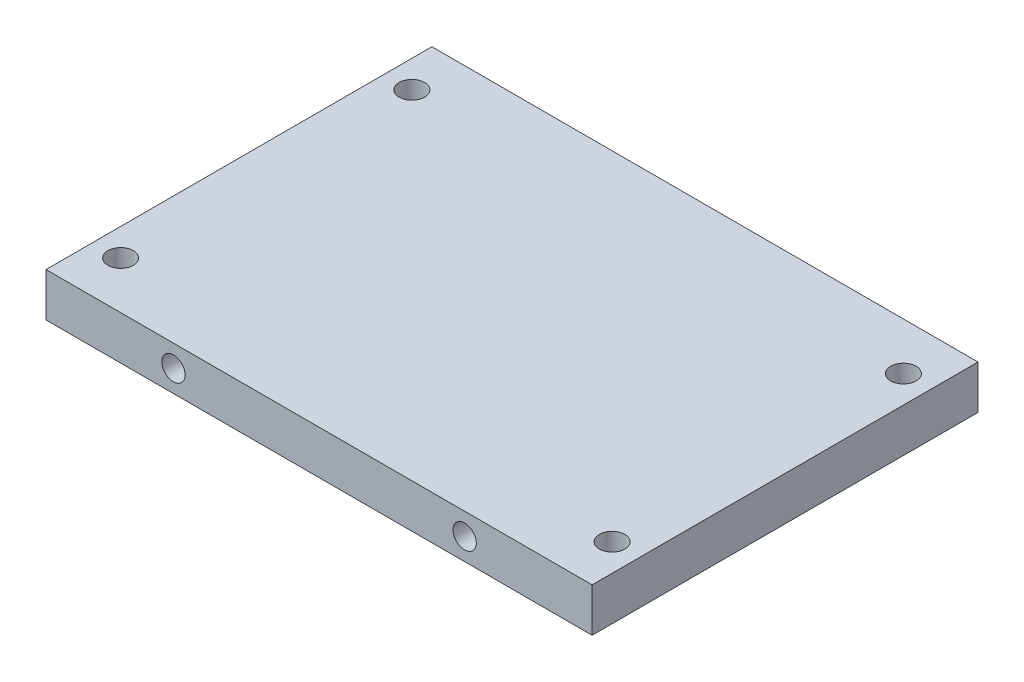
ISO-10303-21;
HEADER;
FILE_DESCRIPTION(('STEP AP214'),'2;1');
FILE_NAME('part.step','',(''),(''),'','','');
FILE_SCHEMA(('AUTOMOTIVE_DESIGN { 1 0 10303 214 1 1 1 1 }'));
ENDSEC;
DATA;
#1=APPLICATION_CONTEXT('core data for automotive mechanical design processes');
#2=APPLICATION_PROTOCOL_DEFINITION('international standard','automotive_design',2000,#1);
#3=PRODUCT_CONTEXT('',#1,'mechanical');
#4=PRODUCT('Part','Part','',(#3));
#5=PRODUCT_RELATED_PRODUCT_CATEGORY('part','',(#4));
#6=PRODUCT_DEFINITION_FORMATION('','',#4);
#7=PRODUCT_DEFINITION_CONTEXT('part definition',#1,'design');
#8=PRODUCT_DEFINITION('design','',#6,#7);
#9=PRODUCT_DEFINITION_SHAPE('','',#8);
#10=(LENGTH_UNIT() NAMED_UNIT(*) SI_UNIT(.MILLI.,.METRE.));
#11=(NAMED_UNIT(*) PLANE_ANGLE_UNIT() SI_UNIT($,.RADIAN.));
#12=(NAMED_UNIT(*) SI_UNIT($,.STERADIAN.) SOLID_ANGLE_UNIT());
#13=UNCERTAINTY_MEASURE_WITH_UNIT(LENGTH_MEASURE(1.E-05),#10,'distance_accuracy_value','');
#14=(GEOMETRIC_REPRESENTATION_CONTEXT(3) GLOBAL_UNCERTAINTY_ASSIGNED_CONTEXT((#13)) GLOBAL_UNIT_ASSIGNED_CONTEXT((#10,
#11,#12)) REPRESENTATION_CONTEXT('',''));
#15=CARTESIAN_POINT('',(0.,0.,0.));
#16=DIRECTION('',(0.,0.,1.));
#17=DIRECTION('',(1.,0.,0.));
#18=AXIS2_PLACEMENT_3D('',#15,#16,#17);
#19=CARTESIAN_POINT('',(0.,6.,53.));
#20=DIRECTION('',(0.,0.,-1.));
#21=DIRECTION('',(-1.,0.,0.));
#22=AXIS2_PLACEMENT_3D('',#19,#20,#21);
#23=PLANE('',#22);
#24=CARTESIAN_POINT('',(57.5,3.,52.9999999999998));
#25=DIRECTION('',(0.,0.,-1.));
#26=DIRECTION('',(-1.,0.,0.));
#27=AXIS2_PLACEMENT_3D('',#24,#25,#26);
#28=CIRCLE('',#27,1.6);
#29=CARTESIAN_POINT('',(55.9,3.,52.9999999999998));
#30=VERTEX_POINT('',#29);
#31=EDGE_CURVE('E203',#30,#30,#28,.T.);
#32=ORIENTED_EDGE('',*,*,#31,.T.);
#33=EDGE_LOOP('',(#32));
#34=FACE_BOUND('',#33,.T.);
#35=CARTESIAN_POINT('',(17.5,3.,53.));
#36=DIRECTION('',(0.,0.,-1.));
#37=DIRECTION('',(-1.,0.,0.));
#38=AXIS2_PLACEMENT_3D('',#35,#36,#37);
#39=CIRCLE('',#38,1.6);
#40=CARTESIAN_POINT('',(15.9,3.,53.));
#41=VERTEX_POINT('',#40);
#42=EDGE_CURVE('E197',#41,#41,#39,.T.);
#43=ORIENTED_EDGE('',*,*,#42,.T.);
#44=EDGE_LOOP('',(#43));
#45=FACE_BOUND('',#44,.T.);
#46=DIRECTION('',(1.,0.,0.));
#47=VECTOR('',#46,1.);
#48=CARTESIAN_POINT('',(0.,0.,53.));
#49=LINE('',#48,#47);
#50=CARTESIAN_POINT('',(0.,0.,53.));
#51=VERTEX_POINT('',#50);
#52=CARTESIAN_POINT('',(75.,0.,53.));
#53=VERTEX_POINT('',#52);
#54=EDGE_CURVE('E112',#51,#53,#49,.T.);
#55=ORIENTED_EDGE('',*,*,#54,.T.);
#56=DIRECTION('',(0.,-1.,0.));
#57=VECTOR('',#56,1.);
#58=CARTESIAN_POINT('',(75.,6.,53.));
#59=LINE('',#58,#57);
#60=CARTESIAN_POINT('',(75.,6.,53.));
#61=VERTEX_POINT('',#60);
#62=EDGE_CURVE('E11',#61,#53,#59,.T.);
#63=ORIENTED_EDGE('',*,*,#62,.F.);
#64=DIRECTION('',(1.,0.,0.));
#65=VECTOR('',#64,1.);
#66=CARTESIAN_POINT('',(0.,6.,53.));
#67=LINE('',#66,#65);
#68=CARTESIAN_POINT('',(0.,6.,53.));
#69=VERTEX_POINT('',#68);
#70=EDGE_CURVE('E75',#69,#61,#67,.T.);
#71=ORIENTED_EDGE('',*,*,#70,.F.);
#72=DIRECTION('',(0.,-1.,0.));
#73=VECTOR('',#72,1.);
#74=CARTESIAN_POINT('',(0.,6.,53.));
#75=LINE('',#74,#73);
#76=EDGE_CURVE('E101',#69,#51,#75,.T.);
#77=ORIENTED_EDGE('',*,*,#76,.T.);
#78=EDGE_LOOP('',(#55,#63,#71,#77));
#79=FACE_BOUND('',#78,.T.);
#80=ADVANCED_FACE('F35',(#34,#45,#79),#23,.F.);
#81=CARTESIAN_POINT('',(75.,6.,0.));
#82=DIRECTION('',(1.,0.,0.));
#83=DIRECTION('',(0.,0.,-1.));
#84=AXIS2_PLACEMENT_3D('',#81,#82,#83);
#85=PLANE('',#84);
#86=DIRECTION('',(0.,0.,1.));
#87=VECTOR('',#86,1.);
#88=CARTESIAN_POINT('',(75.,0.,0.));
#89=LINE('',#88,#87);
#90=CARTESIAN_POINT('',(75.,0.,0.));
#91=VERTEX_POINT('',#90);
#92=EDGE_CURVE('E84',#91,#53,#89,.T.);
#93=ORIENTED_EDGE('',*,*,#92,.F.);
#94=DIRECTION('',(0.,-1.,0.));
#95=VECTOR('',#94,1.);
#96=CARTESIAN_POINT('',(75.,6.,0.));
#97=LINE('',#96,#95);
#98=CARTESIAN_POINT('',(75.,6.,0.));
#99=VERTEX_POINT('',#98);
#100=EDGE_CURVE('E44',#99,#91,#97,.T.);
#101=ORIENTED_EDGE('',*,*,#100,.F.);
#102=DIRECTION('',(0.,0.,1.));
#103=VECTOR('',#102,1.);
#104=CARTESIAN_POINT('',(75.,6.,0.));
#105=LINE('',#104,#103);
#106=EDGE_CURVE('E82',#99,#61,#105,.T.);
#107=ORIENTED_EDGE('',*,*,#106,.T.);
#108=ORIENTED_EDGE('',*,*,#62,.T.);
#109=EDGE_LOOP('',(#93,#101,#107,#108));
#110=FACE_BOUND('',#109,.T.);
#111=ADVANCED_FACE('F81',(#110),#85,.T.);
#112=CARTESIAN_POINT('',(0.,6.,0.));
#113=DIRECTION('',(0.,0.,-1.));
#114=DIRECTION('',(-1.,0.,0.));
#115=AXIS2_PLACEMENT_3D('',#112,#113,#114);
#116=PLANE('',#115);
#117=CARTESIAN_POINT('',(57.5,3.,1.70702308155606E-13));
#118=DIRECTION('',(0.,0.,-1.));
#119=DIRECTION('',(-1.,0.,0.));
#120=AXIS2_PLACEMENT_3D('',#117,#118,#119);
#121=CIRCLE('',#120,1.6);
#122=CARTESIAN_POINT('',(55.9,3.,1.65952330885189E-13));
#123=VERTEX_POINT('',#122);
#124=EDGE_CURVE('E192',#123,#123,#121,.T.);
#125=ORIENTED_EDGE('',*,*,#124,.F.);
#126=EDGE_LOOP('',(#125));
#127=FACE_BOUND('',#126,.T.);
#128=CARTESIAN_POINT('',(17.5,3.,0.));
#129=DIRECTION('',(0.,0.,-1.));
#130=DIRECTION('',(-1.,0.,0.));
#131=AXIS2_PLACEMENT_3D('',#128,#129,#130);
#132=CIRCLE('',#131,1.6);
#133=CARTESIAN_POINT('',(15.9,3.,0.));
#134=VERTEX_POINT('',#133);
#135=EDGE_CURVE('E185',#134,#134,#132,.T.);
#136=ORIENTED_EDGE('',*,*,#135,.F.);
#137=EDGE_LOOP('',(#136));
#138=FACE_BOUND('',#137,.T.);
#139=DIRECTION('',(1.,0.,0.));
#140=VECTOR('',#139,1.);
#141=CARTESIAN_POINT('',(0.,0.,0.));
#142=LINE('',#141,#140);
#143=CARTESIAN_POINT('',(0.,0.,0.));
#144=VERTEX_POINT('',#143);
#145=EDGE_CURVE('E116',#144,#91,#142,.T.);
#146=ORIENTED_EDGE('',*,*,#145,.F.);
#147=DIRECTION('',(0.,-1.,0.));
#148=VECTOR('',#147,1.);
#149=CARTESIAN_POINT('',(0.,6.,0.));
#150=LINE('',#149,#148);
#151=CARTESIAN_POINT('',(0.,6.,0.));
#152=VERTEX_POINT('',#151);
#153=EDGE_CURVE('E67',#152,#144,#150,.T.);
#154=ORIENTED_EDGE('',*,*,#153,.F.);
#155=DIRECTION('',(1.,0.,0.));
#156=VECTOR('',#155,1.);
#157=CARTESIAN_POINT('',(0.,6.,0.));
#158=LINE('',#157,#156);
#159=EDGE_CURVE('E91',#152,#99,#158,.T.);
#160=ORIENTED_EDGE('',*,*,#159,.T.);
#161=ORIENTED_EDGE('',*,*,#100,.T.);
#162=EDGE_LOOP('',(#146,#154,#160,#161));
#163=FACE_BOUND('',#162,.T.);
#164=ADVANCED_FACE('F93',(#127,#138,#163),#116,.T.);
#165=CARTESIAN_POINT('',(0.,6.,0.));
#166=DIRECTION('',(1.,0.,0.));
#167=DIRECTION('',(0.,0.,-1.));
#168=AXIS2_PLACEMENT_3D('',#165,#166,#167);
#169=PLANE('',#168);
#170=DIRECTION('',(0.,0.,1.));
#171=VECTOR('',#170,1.);
#172=CARTESIAN_POINT('',(0.,0.,0.));
#173=LINE('',#172,#171);
#174=EDGE_CURVE('E70',#144,#51,#173,.T.);
#175=ORIENTED_EDGE('',*,*,#174,.T.);
#176=ORIENTED_EDGE('',*,*,#76,.F.);
#177=DIRECTION('',(0.,0.,1.));
#178=VECTOR('',#177,1.);
#179=CARTESIAN_POINT('',(0.,6.,0.));
#180=LINE('',#179,#178);
#181=EDGE_CURVE('E52',#152,#69,#180,.T.);
#182=ORIENTED_EDGE('',*,*,#181,.F.);
#183=ORIENTED_EDGE('',*,*,#153,.T.);
#184=EDGE_LOOP('',(#175,#176,#182,#183));
#185=FACE_BOUND('',#184,.T.);
#186=ADVANCED_FACE('F162',(#185),#169,.F.);
#187=CARTESIAN_POINT('',(71.25,6.,6.49999999999999));
#188=DIRECTION('',(0.,-1.,0.));
#189=DIRECTION('',(0.,0.,-1.));
#190=AXIS2_PLACEMENT_3D('',#187,#188,#189);
#191=CYLINDRICAL_SURFACE('',#190,1.75);
#192=CARTESIAN_POINT('',(71.25,6.,6.49999999999999));
#193=DIRECTION('',(0.,1.,0.));
#194=DIRECTION('',(0.,0.,1.));
#195=AXIS2_PLACEMENT_3D('',#192,#193,#194);
#196=CIRCLE('',#195,1.75);
#197=CARTESIAN_POINT('',(71.25,6.,8.24999999999999));
#198=VERTEX_POINT('',#197);
#199=EDGE_CURVE('E178',#198,#198,#196,.T.);
#200=ORIENTED_EDGE('',*,*,#199,.T.);
#201=EDGE_LOOP('',(#200));
#202=FACE_BOUND('',#201,.T.);
#203=CARTESIAN_POINT('',(71.25,0.,6.49999999999999));
#204=DIRECTION('',(0.,1.,0.));
#205=DIRECTION('',(0.,0.,1.));
#206=AXIS2_PLACEMENT_3D('',#203,#204,#205);
#207=CIRCLE('',#206,1.75);
#208=CARTESIAN_POINT('',(71.25,0.,8.24999999999999));
#209=VERTEX_POINT('',#208);
#210=EDGE_CURVE('E109',#209,#209,#207,.T.);
#211=ORIENTED_EDGE('',*,*,#210,.F.);
#212=EDGE_LOOP('',(#211));
#213=FACE_BOUND('',#212,.T.);
#214=ADVANCED_FACE('F160',(#202,#213),#191,.F.);
#215=CARTESIAN_POINT('',(3.75,6.,6.49999999999999));
#216=DIRECTION('',(0.,-1.,0.));
#217=DIRECTION('',(0.,0.,-1.));
#218=AXIS2_PLACEMENT_3D('',#215,#216,#217);
#219=CYLINDRICAL_SURFACE('',#218,1.75);
#220=CARTESIAN_POINT('',(3.75,6.,6.49999999999999));
#221=DIRECTION('',(0.,1.,0.));
#222=DIRECTION('',(0.,0.,1.));
#223=AXIS2_PLACEMENT_3D('',#220,#221,#222);
#224=CIRCLE('',#223,1.75);
#225=CARTESIAN_POINT('',(3.75,6.,8.24999999999999));
#226=VERTEX_POINT('',#225);
#227=EDGE_CURVE('E171',#226,#226,#224,.F.);
#228=ORIENTED_EDGE('',*,*,#227,.F.);
#229=EDGE_LOOP('',(#228));
#230=FACE_BOUND('',#229,.T.);
#231=CARTESIAN_POINT('',(3.75,0.,6.49999999999999));
#232=DIRECTION('',(0.,1.,0.));
#233=DIRECTION('',(0.,0.,1.));
#234=AXIS2_PLACEMENT_3D('',#231,#232,#233);
#235=CIRCLE('',#234,1.75);
#236=CARTESIAN_POINT('',(3.75,0.,8.24999999999999));
#237=VERTEX_POINT('',#236);
#238=EDGE_CURVE('E105',#237,#237,#235,.F.);
#239=ORIENTED_EDGE('',*,*,#238,.T.);
#240=EDGE_LOOP('',(#239));
#241=FACE_BOUND('',#240,.T.);
#242=ADVANCED_FACE('F145',(#230,#241),#219,.F.);
#243=CARTESIAN_POINT('',(3.75,6.,46.5));
#244=DIRECTION('',(0.,-1.,0.));
#245=DIRECTION('',(0.,0.,-1.));
#246=AXIS2_PLACEMENT_3D('',#243,#244,#245);
#247=CYLINDRICAL_SURFACE('',#246,1.75);
#248=CARTESIAN_POINT('',(3.75,6.,46.5));
#249=DIRECTION('',(0.,1.,0.));
#250=DIRECTION('',(0.,0.,1.));
#251=AXIS2_PLACEMENT_3D('',#248,#249,#250);
#252=CIRCLE('',#251,1.75);
#253=CARTESIAN_POINT('',(3.75,6.,48.25));
#254=VERTEX_POINT('',#253);
#255=EDGE_CURVE('E122',#254,#254,#252,.T.);
#256=ORIENTED_EDGE('',*,*,#255,.T.);
#257=EDGE_LOOP('',(#256));
#258=FACE_BOUND('',#257,.T.);
#259=CARTESIAN_POINT('',(3.75,0.,46.5));
#260=DIRECTION('',(0.,1.,0.));
#261=DIRECTION('',(0.,0.,1.));
#262=AXIS2_PLACEMENT_3D('',#259,#260,#261);
#263=CIRCLE('',#262,1.75);
#264=CARTESIAN_POINT('',(3.75,0.,48.25));
#265=VERTEX_POINT('',#264);
#266=EDGE_CURVE('E102',#265,#265,#263,.T.);
#267=ORIENTED_EDGE('',*,*,#266,.F.);
#268=EDGE_LOOP('',(#267));
#269=FACE_BOUND('',#268,.T.);
#270=ADVANCED_FACE('F37',(#258,#269),#247,.F.);
#271=CARTESIAN_POINT('',(71.25,6.,46.5));
#272=DIRECTION('',(0.,-1.,0.));
#273=DIRECTION('',(0.,0.,-1.));
#274=AXIS2_PLACEMENT_3D('',#271,#272,#273);
#275=CYLINDRICAL_SURFACE('',#274,1.75);
#276=CARTESIAN_POINT('',(71.25,6.,46.5));
#277=DIRECTION('',(0.,1.,0.));
#278=DIRECTION('',(0.,0.,1.));
#279=AXIS2_PLACEMENT_3D('',#276,#277,#278);
#280=CIRCLE('',#279,1.75);
#281=CARTESIAN_POINT('',(71.25,6.,48.25));
#282=VERTEX_POINT('',#281);
#283=EDGE_CURVE('E95',#282,#282,#280,.F.);
#284=ORIENTED_EDGE('',*,*,#283,.F.);
#285=EDGE_LOOP('',(#284));
#286=FACE_BOUND('',#285,.T.);
#287=CARTESIAN_POINT('',(71.25,0.,46.5));
#288=DIRECTION('',(0.,1.,0.));
#289=DIRECTION('',(0.,0.,1.));
#290=AXIS2_PLACEMENT_3D('',#287,#288,#289);
#291=CIRCLE('',#290,1.75);
#292=CARTESIAN_POINT('',(71.25,0.,48.25));
#293=VERTEX_POINT('',#292);
#294=EDGE_CURVE('E119',#293,#293,#291,.F.);
#295=ORIENTED_EDGE('',*,*,#294,.T.);
#296=EDGE_LOOP('',(#295));
#297=FACE_BOUND('',#296,.T.);
#298=ADVANCED_FACE('F135',(#286,#297),#275,.F.);
#299=CARTESIAN_POINT('',(0.,6.,0.));
#300=DIRECTION('',(0.,1.,0.));
#301=DIRECTION('',(0.,0.,1.));
#302=AXIS2_PLACEMENT_3D('',#299,#300,#301);
#303=PLANE('',#302);
#304=ORIENTED_EDGE('',*,*,#255,.F.);
#305=EDGE_LOOP('',(#304));
#306=FACE_BOUND('',#305,.T.);
#307=ORIENTED_EDGE('',*,*,#227,.T.);
#308=EDGE_LOOP('',(#307));
#309=FACE_BOUND('',#308,.T.);
#310=ORIENTED_EDGE('',*,*,#199,.F.);
#311=EDGE_LOOP('',(#310));
#312=FACE_BOUND('',#311,.T.);
#313=ORIENTED_EDGE('',*,*,#70,.T.);
#314=ORIENTED_EDGE('',*,*,#106,.F.);
#315=ORIENTED_EDGE('',*,*,#159,.F.);
#316=ORIENTED_EDGE('',*,*,#181,.T.);
#317=EDGE_LOOP('',(#313,#314,#315,#316));
#318=FACE_BOUND('',#317,.T.);
#319=ORIENTED_EDGE('',*,*,#283,.T.);
#320=EDGE_LOOP('',(#319));
#321=FACE_BOUND('',#320,.T.);
#322=ADVANCED_FACE('F89',(#306,#309,#312,#318,#321),#303,.T.);
#323=CARTESIAN_POINT('',(0.,0.,0.));
#324=DIRECTION('',(0.,1.,0.));
#325=DIRECTION('',(0.,0.,1.));
#326=AXIS2_PLACEMENT_3D('',#323,#324,#325);
#327=PLANE('',#326);
#328=ORIENTED_EDGE('',*,*,#266,.T.);
#329=EDGE_LOOP('',(#328));
#330=FACE_BOUND('',#329,.T.);
#331=ORIENTED_EDGE('',*,*,#238,.F.);
#332=EDGE_LOOP('',(#331));
#333=FACE_BOUND('',#332,.T.);
#334=ORIENTED_EDGE('',*,*,#210,.T.);
#335=EDGE_LOOP('',(#334));
#336=FACE_BOUND('',#335,.T.);
#337=ORIENTED_EDGE('',*,*,#54,.F.);
#338=ORIENTED_EDGE('',*,*,#174,.F.);
#339=ORIENTED_EDGE('',*,*,#145,.T.);
#340=ORIENTED_EDGE('',*,*,#92,.T.);
#341=EDGE_LOOP('',(#337,#338,#339,#340));
#342=FACE_BOUND('',#341,.T.);
#343=ORIENTED_EDGE('',*,*,#294,.F.);
#344=EDGE_LOOP('',(#343));
#345=FACE_BOUND('',#344,.T.);
#346=ADVANCED_FACE('F127',(#330,#333,#336,#342,#345),#327,.F.);
#347=CARTESIAN_POINT('',(17.5,3.,5.00000000000005));
#348=DIRECTION('',(0.,0.,-1.));
#349=DIRECTION('',(-1.,0.,0.));
#350=AXIS2_PLACEMENT_3D('',#347,#348,#349);
#351=CYLINDRICAL_SURFACE('',#350,1.6);
#352=CARTESIAN_POINT('',(17.5,3.,5.00000000000005));
#353=DIRECTION('',(0.,0.,-1.));
#354=DIRECTION('',(-1.,0.,0.));
#355=AXIS2_PLACEMENT_3D('',#352,#353,#354);
#356=CIRCLE('',#355,1.6);
#357=CARTESIAN_POINT('',(15.9,3.,5.00000000000005));
#358=VERTEX_POINT('',#357);
#359=EDGE_CURVE('E188',#358,#358,#356,.T.);
#360=ORIENTED_EDGE('',*,*,#359,.F.);
#361=EDGE_LOOP('',(#360));
#362=FACE_BOUND('',#361,.T.);
#363=ORIENTED_EDGE('',*,*,#135,.T.);
#364=EDGE_LOOP('',(#363));
#365=FACE_BOUND('',#364,.T.);
#366=ADVANCED_FACE('F130',(#362,#365),#351,.F.);
#367=CARTESIAN_POINT('',(17.5,3.,5.00000000000005));
#368=DIRECTION('',(0.,0.,-1.));
#369=DIRECTION('',(-1.,0.,0.));
#370=AXIS2_PLACEMENT_3D('',#367,#368,#369);
#371=PLANE('',#370);
#372=ORIENTED_EDGE('',*,*,#359,.T.);
#373=EDGE_LOOP('',(#372));
#374=FACE_BOUND('',#373,.T.);
#375=ADVANCED_FACE('F234',(#374),#371,.T.);
#376=CARTESIAN_POINT('',(57.5,3.,5.00000000000017));
#377=DIRECTION('',(0.,0.,-1.));
#378=DIRECTION('',(-1.,0.,0.));
#379=AXIS2_PLACEMENT_3D('',#376,#377,#378);
#380=CYLINDRICAL_SURFACE('',#379,1.6);
#381=CARTESIAN_POINT('',(57.5,3.,5.00000000000017));
#382=DIRECTION('',(0.,0.,-1.));
#383=DIRECTION('',(-1.,0.,0.));
#384=AXIS2_PLACEMENT_3D('',#381,#382,#383);
#385=CIRCLE('',#384,1.6);
#386=CARTESIAN_POINT('',(55.9,3.,5.00000000000017));
#387=VERTEX_POINT('',#386);
#388=EDGE_CURVE('E106',#387,#387,#385,.T.);
#389=ORIENTED_EDGE('',*,*,#388,.F.);
#390=EDGE_LOOP('',(#389));
#391=FACE_BOUND('',#390,.T.);
#392=ORIENTED_EDGE('',*,*,#124,.T.);
#393=EDGE_LOOP('',(#392));
#394=FACE_BOUND('',#393,.T.);
#395=ADVANCED_FACE('F230',(#391,#394),#380,.F.);
#396=CARTESIAN_POINT('',(57.5,3.,5.00000000000017));
#397=DIRECTION('',(0.,0.,-1.));
#398=DIRECTION('',(-1.,0.,0.));
#399=AXIS2_PLACEMENT_3D('',#396,#397,#398);
#400=PLANE('',#399);
#401=ORIENTED_EDGE('',*,*,#388,.T.);
#402=EDGE_LOOP('',(#401));
#403=FACE_BOUND('',#402,.T.);
#404=ADVANCED_FACE('F226',(#403),#400,.T.);
#405=CARTESIAN_POINT('',(17.5,3.,48.));
#406=DIRECTION('',(0.,0.,1.));
#407=DIRECTION('',(1.,0.,0.));
#408=AXIS2_PLACEMENT_3D('',#405,#406,#407);
#409=CYLINDRICAL_SURFACE('',#408,1.6);
#410=CARTESIAN_POINT('',(17.5,3.,48.));
#411=DIRECTION('',(0.,0.,-1.));
#412=DIRECTION('',(-1.,0.,0.));
#413=AXIS2_PLACEMENT_3D('',#410,#411,#412);
#414=CIRCLE('',#413,1.6);
#415=CARTESIAN_POINT('',(15.9,3.,48.));
#416=VERTEX_POINT('',#415);
#417=EDGE_CURVE('E200',#416,#416,#414,.T.);
#418=ORIENTED_EDGE('',*,*,#417,.T.);
#419=EDGE_LOOP('',(#418));
#420=FACE_BOUND('',#419,.T.);
#421=ORIENTED_EDGE('',*,*,#42,.F.);
#422=EDGE_LOOP('',(#421));
#423=FACE_BOUND('',#422,.T.);
#424=ADVANCED_FACE('F222',(#420,#423),#409,.F.);
#425=CARTESIAN_POINT('',(17.5,3.,48.));
#426=DIRECTION('',(0.,0.,1.));
#427=DIRECTION('',(-1.,0.,0.));
#428=AXIS2_PLACEMENT_3D('',#425,#426,#427);
#429=PLANE('',#428);
#430=ORIENTED_EDGE('',*,*,#417,.F.);
#431=EDGE_LOOP('',(#430));
#432=FACE_BOUND('',#431,.T.);
#433=ADVANCED_FACE('F217',(#432),#429,.T.);
#434=CARTESIAN_POINT('',(57.5,3.,47.9999999999998));
#435=DIRECTION('',(0.,0.,1.));
#436=DIRECTION('',(1.,0.,0.));
#437=AXIS2_PLACEMENT_3D('',#434,#435,#436);
#438=CYLINDRICAL_SURFACE('',#437,1.6);
#439=CARTESIAN_POINT('',(57.5,3.,47.9999999999998));
#440=DIRECTION('',(0.,0.,-1.));
#441=DIRECTION('',(-1.,0.,0.));
#442=AXIS2_PLACEMENT_3D('',#439,#440,#441);
#443=CIRCLE('',#442,1.6);
#444=CARTESIAN_POINT('',(55.9,3.,47.9999999999998));
#445=VERTEX_POINT('',#444);
#446=EDGE_CURVE('E189',#445,#445,#443,.T.);
#447=ORIENTED_EDGE('',*,*,#446,.T.);
#448=EDGE_LOOP('',(#447));
#449=FACE_BOUND('',#448,.T.);
#450=ORIENTED_EDGE('',*,*,#31,.F.);
#451=EDGE_LOOP('',(#450));
#452=FACE_BOUND('',#451,.T.);
#453=ADVANCED_FACE('F208',(#449,#452),#438,.F.);
#454=CARTESIAN_POINT('',(57.5,3.,47.9999999999998));
#455=DIRECTION('',(0.,0.,1.));
#456=DIRECTION('',(-1.,0.,0.));
#457=AXIS2_PLACEMENT_3D('',#454,#455,#456);
#458=PLANE('',#457);
#459=ORIENTED_EDGE('',*,*,#446,.F.);
#460=EDGE_LOOP('',(#459));
#461=FACE_BOUND('',#460,.T.);
#462=ADVANCED_FACE('F211',(#461),#458,.T.);
#463=CLOSED_SHELL('',(#80,#111,#164,#186,#214,#242,#270,#298,#322,#346,#366,#375,#395,#404,#424,
#433,#453,#462));
#464=MANIFOLD_SOLID_BREP('B2',#463);
#465=ADVANCED_BREP_SHAPE_REPRESENTATION('',(#18,#464),#14);
#466=SHAPE_DEFINITION_REPRESENTATION(#9,#465);
ENDSEC;
END-ISO-10303-21;
